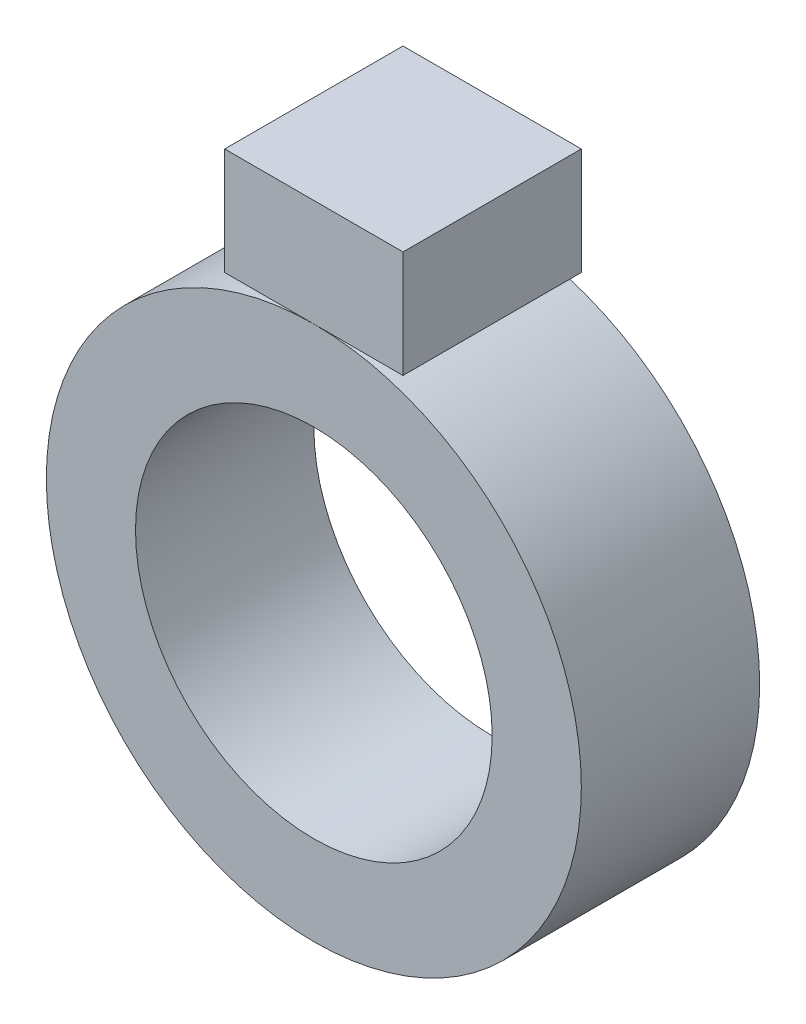
ISO-10303-21;
HEADER;
FILE_DESCRIPTION(('STEP AP214'),'2;1');
FILE_NAME('part.step','',(''),(''),'','','');
FILE_SCHEMA(('AUTOMOTIVE_DESIGN { 1 0 10303 214 1 1 1 1 }'));
ENDSEC;
DATA;
#1=APPLICATION_CONTEXT('core data for automotive mechanical design processes');
#2=APPLICATION_PROTOCOL_DEFINITION('international standard','automotive_design',2000,#1);
#3=PRODUCT_CONTEXT('',#1,'mechanical');
#4=PRODUCT('Part','Part','',(#3));
#5=PRODUCT_RELATED_PRODUCT_CATEGORY('part','',(#4));
#6=PRODUCT_DEFINITION_FORMATION('','',#4);
#7=PRODUCT_DEFINITION_CONTEXT('part definition',#1,'design');
#8=PRODUCT_DEFINITION('design','',#6,#7);
#9=PRODUCT_DEFINITION_SHAPE('','',#8);
#10=(LENGTH_UNIT() NAMED_UNIT(*) SI_UNIT(.MILLI.,.METRE.));
#11=(NAMED_UNIT(*) PLANE_ANGLE_UNIT() SI_UNIT($,.RADIAN.));
#12=(NAMED_UNIT(*) SI_UNIT($,.STERADIAN.) SOLID_ANGLE_UNIT());
#13=UNCERTAINTY_MEASURE_WITH_UNIT(LENGTH_MEASURE(1.E-05),#10,'distance_accuracy_value','');
#14=(GEOMETRIC_REPRESENTATION_CONTEXT(3) GLOBAL_UNCERTAINTY_ASSIGNED_CONTEXT((#13)) GLOBAL_UNIT_ASSIGNED_CONTEXT((#10,
#11,#12)) REPRESENTATION_CONTEXT('',''));
#15=CARTESIAN_POINT('',(0.,0.,0.));
#16=DIRECTION('',(0.,0.,1.));
#17=DIRECTION('',(1.,0.,0.));
#18=AXIS2_PLACEMENT_3D('',#15,#16,#17);
#19=CARTESIAN_POINT('',(2.5,10.5,5.));
#20=DIRECTION('',(-1.,0.,0.));
#21=DIRECTION('',(0.,0.,1.));
#22=AXIS2_PLACEMENT_3D('',#19,#20,#21);
#23=PLANE('',#22);
#24=DIRECTION('',(0.,0.,-1.));
#25=VECTOR('',#24,1.);
#26=CARTESIAN_POINT('',(2.5,7.5,5.));
#27=LINE('',#26,#25);
#28=CARTESIAN_POINT('',(2.5,7.5,5.));
#29=VERTEX_POINT('',#28);
#30=CARTESIAN_POINT('',(2.5,7.5,0.));
#31=VERTEX_POINT('',#30);
#32=EDGE_CURVE('E115',#29,#31,#27,.T.);
#33=ORIENTED_EDGE('',*,*,#32,.T.);
#34=DIRECTION('',(0.,-1.,0.));
#35=VECTOR('',#34,1.);
#36=CARTESIAN_POINT('',(2.5,10.5,0.));
#37=LINE('',#36,#35);
#38=CARTESIAN_POINT('',(2.5,10.5,0.));
#39=VERTEX_POINT('',#38);
#40=EDGE_CURVE('E12',#39,#31,#37,.T.);
#41=ORIENTED_EDGE('',*,*,#40,.F.);
#42=DIRECTION('',(0.,0.,-1.));
#43=VECTOR('',#42,1.);
#44=CARTESIAN_POINT('',(2.5,10.5,5.));
#45=LINE('',#44,#43);
#46=CARTESIAN_POINT('',(2.5,10.5,5.));
#47=VERTEX_POINT('',#46);
#48=EDGE_CURVE('E98',#47,#39,#45,.T.);
#49=ORIENTED_EDGE('',*,*,#48,.F.);
#50=DIRECTION('',(0.,-1.,0.));
#51=VECTOR('',#50,1.);
#52=CARTESIAN_POINT('',(2.5,10.5,5.));
#53=LINE('',#52,#51);
#54=EDGE_CURVE('E111',#47,#29,#53,.T.);
#55=ORIENTED_EDGE('',*,*,#54,.T.);
#56=EDGE_LOOP('',(#33,#41,#49,#55));
#57=FACE_BOUND('',#56,.T.);
#58=ADVANCED_FACE('F46',(#57),#23,.F.);
#59=CARTESIAN_POINT('',(-2.5,10.5,0.));
#60=DIRECTION('',(0.,0.,1.));
#61=DIRECTION('',(1.,0.,0.));
#62=AXIS2_PLACEMENT_3D('',#59,#60,#61);
#63=PLANE('',#62);
#64=DIRECTION('',(-1.,0.,0.));
#65=VECTOR('',#64,1.);
#66=CARTESIAN_POINT('',(-2.5,7.5,0.));
#67=LINE('',#66,#65);
#68=CARTESIAN_POINT('',(-2.5,7.5,0.));
#69=VERTEX_POINT('',#68);
#70=EDGE_CURVE('E103',#31,#69,#67,.T.);
#71=ORIENTED_EDGE('',*,*,#70,.T.);
#72=DIRECTION('',(0.,-1.,0.));
#73=VECTOR('',#72,1.);
#74=CARTESIAN_POINT('',(-2.5,10.5,0.));
#75=LINE('',#74,#73);
#76=CARTESIAN_POINT('',(-2.5,10.5,0.));
#77=VERTEX_POINT('',#76);
#78=EDGE_CURVE('E55',#77,#69,#75,.T.);
#79=ORIENTED_EDGE('',*,*,#78,.F.);
#80=DIRECTION('',(-1.,0.,0.));
#81=VECTOR('',#80,1.);
#82=CARTESIAN_POINT('',(-2.5,10.5,0.));
#83=LINE('',#82,#81);
#84=EDGE_CURVE('E93',#39,#77,#83,.T.);
#85=ORIENTED_EDGE('',*,*,#84,.F.);
#86=ORIENTED_EDGE('',*,*,#40,.T.);
#87=EDGE_LOOP('',(#71,#79,#85,#86));
#88=FACE_BOUND('',#87,.T.);
#89=ADVANCED_FACE('F102',(#88),#63,.F.);
#90=CARTESIAN_POINT('',(-2.5,10.5,5.));
#91=DIRECTION('',(1.,0.,0.));
#92=DIRECTION('',(0.,0.,-1.));
#93=AXIS2_PLACEMENT_3D('',#90,#91,#92);
#94=PLANE('',#93);
#95=DIRECTION('',(0.,0.,1.));
#96=VECTOR('',#95,1.);
#97=CARTESIAN_POINT('',(-2.5,7.5,5.));
#98=LINE('',#97,#96);
#99=CARTESIAN_POINT('',(-2.5,7.5,5.));
#100=VERTEX_POINT('',#99);
#101=EDGE_CURVE('E80',#69,#100,#98,.T.);
#102=ORIENTED_EDGE('',*,*,#101,.T.);
#103=DIRECTION('',(0.,-1.,0.));
#104=VECTOR('',#103,1.);
#105=CARTESIAN_POINT('',(-2.5,10.5,5.));
#106=LINE('',#105,#104);
#107=CARTESIAN_POINT('',(-2.5,10.5,5.));
#108=VERTEX_POINT('',#107);
#109=EDGE_CURVE('E105',#108,#100,#106,.T.);
#110=ORIENTED_EDGE('',*,*,#109,.F.);
#111=DIRECTION('',(0.,0.,1.));
#112=VECTOR('',#111,1.);
#113=CARTESIAN_POINT('',(-2.5,10.5,5.));
#114=LINE('',#113,#112);
#115=EDGE_CURVE('E96',#77,#108,#114,.T.);
#116=ORIENTED_EDGE('',*,*,#115,.F.);
#117=ORIENTED_EDGE('',*,*,#78,.T.);
#118=EDGE_LOOP('',(#102,#110,#116,#117));
#119=FACE_BOUND('',#118,.T.);
#120=ADVANCED_FACE('F106',(#119),#94,.F.);
#121=CARTESIAN_POINT('',(-2.5,10.5,5.));
#122=DIRECTION('',(0.,0.,-1.));
#123=DIRECTION('',(-1.,0.,0.));
#124=AXIS2_PLACEMENT_3D('',#121,#122,#123);
#125=PLANE('',#124);
#126=DIRECTION('',(1.,0.,0.));
#127=VECTOR('',#126,1.);
#128=CARTESIAN_POINT('',(-2.5,7.5,5.));
#129=LINE('',#128,#127);
#130=EDGE_CURVE('E86',#100,#29,#129,.T.);
#131=ORIENTED_EDGE('',*,*,#130,.T.);
#132=ORIENTED_EDGE('',*,*,#54,.F.);
#133=DIRECTION('',(1.,0.,0.));
#134=VECTOR('',#133,1.);
#135=CARTESIAN_POINT('',(-2.5,10.5,5.));
#136=LINE('',#135,#134);
#137=EDGE_CURVE('E63',#108,#47,#136,.T.);
#138=ORIENTED_EDGE('',*,*,#137,.F.);
#139=ORIENTED_EDGE('',*,*,#109,.T.);
#140=EDGE_LOOP('',(#131,#132,#138,#139));
#141=FACE_BOUND('',#140,.T.);
#142=ADVANCED_FACE('F129',(#141),#125,.F.);
#143=CARTESIAN_POINT('',(0.,10.5,0.));
#144=DIRECTION('',(0.,-1.,0.));
#145=DIRECTION('',(0.,0.,-1.));
#146=AXIS2_PLACEMENT_3D('',#143,#144,#145);
#147=PLANE('',#146);
#148=ORIENTED_EDGE('',*,*,#48,.T.);
#149=ORIENTED_EDGE('',*,*,#84,.T.);
#150=ORIENTED_EDGE('',*,*,#115,.T.);
#151=ORIENTED_EDGE('',*,*,#137,.T.);
#152=EDGE_LOOP('',(#148,#149,#150,#151));
#153=FACE_BOUND('',#152,.T.);
#154=ADVANCED_FACE('F94',(#153),#147,.F.);
#155=CARTESIAN_POINT('',(0.,7.5,0.));
#156=DIRECTION('',(0.,-1.,0.));
#157=DIRECTION('',(0.,0.,-1.));
#158=AXIS2_PLACEMENT_3D('',#155,#156,#157);
#159=PLANE('',#158);
#160=ORIENTED_EDGE('',*,*,#32,.F.);
#161=ORIENTED_EDGE('',*,*,#130,.F.);
#162=ORIENTED_EDGE('',*,*,#101,.F.);
#163=ORIENTED_EDGE('',*,*,#70,.F.);
#164=EDGE_LOOP('',(#160,#161,#162,#163));
#165=FACE_BOUND('',#164,.T.);
#166=ADVANCED_FACE('F132',(#165),#159,.T.);
#167=CLOSED_SHELL('',(#58,#89,#120,#142,#154,#166));
#168=MANIFOLD_SOLID_BREP('B2',#167);
#169=CARTESIAN_POINT('',(0.,0.,5.));
#170=DIRECTION('',(0.,0.,1.));
#171=DIRECTION('',(1.,0.,0.));
#172=AXIS2_PLACEMENT_3D('',#169,#170,#171);
#173=PLANE('',#172);
#174=CARTESIAN_POINT('',(0.,0.,5.));
#175=DIRECTION('',(0.,0.,1.));
#176=DIRECTION('',(1.,0.,0.));
#177=AXIS2_PLACEMENT_3D('',#174,#175,#176);
#178=CIRCLE('',#177,7.5);
#179=CARTESIAN_POINT('',(7.5,0.,5.));
#180=VERTEX_POINT('',#179);
#181=EDGE_CURVE('E45',#180,#180,#178,.T.);
#182=ORIENTED_EDGE('',*,*,#181,.T.);
#183=EDGE_LOOP('',(#182));
#184=FACE_BOUND('',#183,.T.);
#185=CARTESIAN_POINT('',(0.,0.,5.));
#186=DIRECTION('',(0.,0.,1.));
#187=DIRECTION('',(1.,0.,0.));
#188=AXIS2_PLACEMENT_3D('',#185,#186,#187);
#189=CIRCLE('',#188,5.);
#190=CARTESIAN_POINT('',(5.,0.,5.));
#191=VERTEX_POINT('',#190);
#192=EDGE_CURVE('E219',#191,#191,#189,.T.);
#193=ORIENTED_EDGE('',*,*,#192,.F.);
#194=EDGE_LOOP('',(#193));
#195=FACE_BOUND('',#194,.T.);
#196=ADVANCED_FACE('F205',(#184,#195),#173,.T.);
#197=CARTESIAN_POINT('',(0.,0.,0.));
#198=DIRECTION('',(0.,0.,1.));
#199=DIRECTION('',(1.,0.,0.));
#200=AXIS2_PLACEMENT_3D('',#197,#198,#199);
#201=PLANE('',#200);
#202=CARTESIAN_POINT('',(0.,0.,0.));
#203=DIRECTION('',(0.,0.,1.));
#204=DIRECTION('',(1.,0.,0.));
#205=AXIS2_PLACEMENT_3D('',#202,#203,#204);
#206=CIRCLE('',#205,7.5);
#207=CARTESIAN_POINT('',(7.5,0.,0.));
#208=VERTEX_POINT('',#207);
#209=EDGE_CURVE('E209',#208,#208,#206,.T.);
#210=ORIENTED_EDGE('',*,*,#209,.F.);
#211=EDGE_LOOP('',(#210));
#212=FACE_BOUND('',#211,.T.);
#213=CARTESIAN_POINT('',(0.,0.,0.));
#214=DIRECTION('',(0.,0.,1.));
#215=DIRECTION('',(1.,0.,0.));
#216=AXIS2_PLACEMENT_3D('',#213,#214,#215);
#217=CIRCLE('',#216,5.);
#218=CARTESIAN_POINT('',(5.,0.,0.));
#219=VERTEX_POINT('',#218);
#220=EDGE_CURVE('E221',#219,#219,#217,.T.);
#221=ORIENTED_EDGE('',*,*,#220,.T.);
#222=EDGE_LOOP('',(#221));
#223=FACE_BOUND('',#222,.T.);
#224=ADVANCED_FACE('F234',(#212,#223),#201,.F.);
#225=CARTESIAN_POINT('',(0.,0.,5.));
#226=DIRECTION('',(0.,0.,-1.));
#227=DIRECTION('',(-1.,0.,0.));
#228=AXIS2_PLACEMENT_3D('',#225,#226,#227);
#229=CYLINDRICAL_SURFACE('',#228,7.5);
#230=ORIENTED_EDGE('',*,*,#181,.F.);
#231=EDGE_LOOP('',(#230));
#232=FACE_BOUND('',#231,.T.);
#233=ORIENTED_EDGE('',*,*,#209,.T.);
#234=EDGE_LOOP('',(#233));
#235=FACE_BOUND('',#234,.T.);
#236=ADVANCED_FACE('F207',(#232,#235),#229,.T.);
#237=CARTESIAN_POINT('',(0.,0.,5.));
#238=DIRECTION('',(0.,0.,-1.));
#239=DIRECTION('',(-1.,0.,0.));
#240=AXIS2_PLACEMENT_3D('',#237,#238,#239);
#241=CYLINDRICAL_SURFACE('',#240,5.);
#242=ORIENTED_EDGE('',*,*,#192,.T.);
#243=EDGE_LOOP('',(#242));
#244=FACE_BOUND('',#243,.T.);
#245=ORIENTED_EDGE('',*,*,#220,.F.);
#246=EDGE_LOOP('',(#245));
#247=FACE_BOUND('',#246,.T.);
#248=ADVANCED_FACE('F230',(#244,#247),#241,.F.);
#249=CLOSED_SHELL('',(#196,#224,#236,#248));
#250=MANIFOLD_SOLID_BREP('B6',#249);
#251=ADVANCED_BREP_SHAPE_REPRESENTATION('',(#18,#168,#250),#14);
#252=SHAPE_DEFINITION_REPRESENTATION(#9,#251);
ENDSEC;
END-ISO-10303-21;
